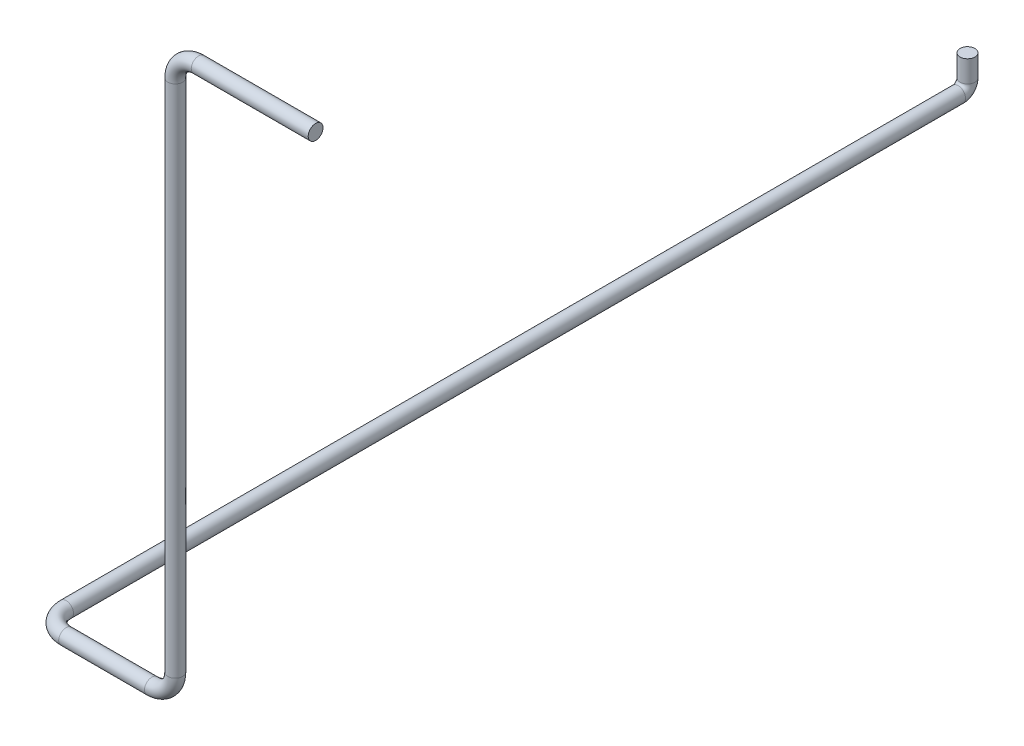
ISO-10303-21;
HEADER;
FILE_DESCRIPTION(('STEP AP214'),'2;1');
FILE_NAME('part.step','',(''),(''),'','','');
FILE_SCHEMA(('AUTOMOTIVE_DESIGN { 1 0 10303 214 1 1 1 1 }'));
ENDSEC;
DATA;
#1=APPLICATION_CONTEXT('core data for automotive mechanical design processes');
#2=APPLICATION_PROTOCOL_DEFINITION('international standard','automotive_design',2000,#1);
#3=PRODUCT_CONTEXT('',#1,'mechanical');
#4=PRODUCT('Part','Part','',(#3));
#5=PRODUCT_RELATED_PRODUCT_CATEGORY('part','',(#4));
#6=PRODUCT_DEFINITION_FORMATION('','',#4);
#7=PRODUCT_DEFINITION_CONTEXT('part definition',#1,'design');
#8=PRODUCT_DEFINITION('design','',#6,#7);
#9=PRODUCT_DEFINITION_SHAPE('','',#8);
#10=(LENGTH_UNIT() NAMED_UNIT(*) SI_UNIT(.MILLI.,.METRE.));
#11=(NAMED_UNIT(*) PLANE_ANGLE_UNIT() SI_UNIT($,.RADIAN.));
#12=(NAMED_UNIT(*) SI_UNIT($,.STERADIAN.) SOLID_ANGLE_UNIT());
#13=UNCERTAINTY_MEASURE_WITH_UNIT(LENGTH_MEASURE(1.E-05),#10,'distance_accuracy_value','');
#14=(GEOMETRIC_REPRESENTATION_CONTEXT(3) GLOBAL_UNCERTAINTY_ASSIGNED_CONTEXT((#13)) GLOBAL_UNIT_ASSIGNED_CONTEXT((#10,
#11,#12)) REPRESENTATION_CONTEXT('',''));
#15=CARTESIAN_POINT('',(0.,0.,0.));
#16=DIRECTION('',(0.,0.,1.));
#17=DIRECTION('',(1.,0.,0.));
#18=AXIS2_PLACEMENT_3D('',#15,#16,#17);
#19=CARTESIAN_POINT('',(0.,-10.,0.));
#20=DIRECTION('',(0.,1.,0.));
#21=DIRECTION('',(0.,0.,1.));
#22=AXIS2_PLACEMENT_3D('',#19,#20,#21);
#23=CYLINDRICAL_SURFACE('',#22,9.525);
#24=CARTESIAN_POINT('',(0.,0.,0.));
#25=DIRECTION('',(0.,1.,0.));
#26=DIRECTION('',(0.,0.,1.));
#27=AXIS2_PLACEMENT_3D('',#24,#25,#26);
#28=CIRCLE('',#27,9.525);
#29=CARTESIAN_POINT('',(0.,0.,9.525));
#30=VERTEX_POINT('',#29);
#31=EDGE_CURVE('E11',#30,#30,#28,.T.);
#32=ORIENTED_EDGE('',*,*,#31,.F.);
#33=EDGE_LOOP('',(#32));
#34=FACE_BOUND('',#33,.T.);
#35=CARTESIAN_POINT('',(0.,-28.,0.));
#36=DIRECTION('',(0.,-1.,0.));
#37=DIRECTION('',(0.,0.,-1.));
#38=AXIS2_PLACEMENT_3D('',#35,#36,#37);
#39=CIRCLE('',#38,9.525);
#40=CARTESIAN_POINT('',(0.,-28.,-9.525));
#41=VERTEX_POINT('',#40);
#42=EDGE_CURVE('E68',#41,#41,#39,.T.);
#43=ORIENTED_EDGE('',*,*,#42,.F.);
#44=EDGE_LOOP('',(#43));
#45=FACE_BOUND('',#44,.T.);
#46=ADVANCED_FACE('F34',(#34,#45),#23,.T.);
#47=CARTESIAN_POINT('',(0.,0.,0.));
#48=DIRECTION('',(0.,1.,0.));
#49=DIRECTION('',(0.,0.,1.));
#50=AXIS2_PLACEMENT_3D('',#47,#48,#49);
#51=PLANE('',#50);
#52=ORIENTED_EDGE('',*,*,#31,.T.);
#53=EDGE_LOOP('',(#52));
#54=FACE_BOUND('',#53,.T.);
#55=ADVANCED_FACE('F75',(#54),#51,.T.);
#56=CARTESIAN_POINT('',(350.,680.,1186.));
#57=DIRECTION('',(1.,0.,0.));
#58=DIRECTION('',(0.,-1.,0.));
#59=AXIS2_PLACEMENT_3D('',#56,#57,#58);
#60=PLANE('',#59);
#61=CARTESIAN_POINT('',(350.,680.,1186.));
#62=DIRECTION('',(1.,0.,0.));
#63=DIRECTION('',(0.,-1.,0.));
#64=AXIS2_PLACEMENT_3D('',#61,#62,#63);
#65=CIRCLE('',#64,9.525);
#66=CARTESIAN_POINT('',(350.,670.475,1186.));
#67=VERTEX_POINT('',#66);
#68=EDGE_CURVE('E40',#67,#67,#65,.T.);
#69=ORIENTED_EDGE('',*,*,#68,.T.);
#70=EDGE_LOOP('',(#69));
#71=FACE_BOUND('',#70,.T.);
#72=ADVANCED_FACE('F44',(#71),#60,.T.);
#73=CARTESIAN_POINT('',(0.,-28.,12.));
#74=DIRECTION('',(-1.,0.,0.));
#75=DIRECTION('',(0.,0.,1.));
#76=AXIS2_PLACEMENT_3D('',#73,#74,#75);
#77=TOROIDAL_SURFACE('',#76,12.,9.525);
#78=CARTESIAN_POINT('',(0.,-40.,12.));
#79=DIRECTION('',(0.,0.,1.));
#80=DIRECTION('',(0.,-1.,0.));
#81=AXIS2_PLACEMENT_3D('',#78,#79,#80);
#82=CIRCLE('',#81,9.525);
#83=CARTESIAN_POINT('',(0.,-49.525,12.));
#84=VERTEX_POINT('',#83);
#85=EDGE_CURVE('E65',#84,#84,#82,.T.);
#86=CARTESIAN_POINT('',(0.,-28.,12.));
#87=DIRECTION('',(-1.,0.,0.));
#88=DIRECTION('',(0.,0.,1.));
#89=AXIS2_PLACEMENT_3D('',#86,#87,#88);
#90=CIRCLE('',#89,21.525);
#91=EDGE_CURVE('',#41,#84,#90,.T.);
#92=ORIENTED_EDGE('',*,*,#42,.T.);
#93=ORIENTED_EDGE('',*,*,#85,.F.);
#94=ORIENTED_EDGE('',*,*,#91,.T.);
#95=ORIENTED_EDGE('',*,*,#91,.F.);
#96=EDGE_LOOP('',(#92,#94,#93,#95));
#97=FACE_BOUND('',#96,.T.);
#98=ADVANCED_FACE('F72',(#97),#77,.T.);
#99=CARTESIAN_POINT('',(0.,-40.,12.));
#100=DIRECTION('',(0.,0.,1.));
#101=DIRECTION('',(1.,0.,0.));
#102=AXIS2_PLACEMENT_3D('',#99,#100,#101);
#103=CYLINDRICAL_SURFACE('',#102,9.525);
#104=CARTESIAN_POINT('',(0.,-40.,1156.));
#105=DIRECTION('',(0.,0.,1.));
#106=DIRECTION('',(0.,-1.,0.));
#107=AXIS2_PLACEMENT_3D('',#104,#105,#106);
#108=CIRCLE('',#107,9.525);
#109=CARTESIAN_POINT('',(-9.52500000000002,-40.,1156.));
#110=VERTEX_POINT('',#109);
#111=EDGE_CURVE('E62',#110,#110,#108,.T.);
#112=ORIENTED_EDGE('',*,*,#111,.F.);
#113=EDGE_LOOP('',(#112));
#114=FACE_BOUND('',#113,.T.);
#115=ORIENTED_EDGE('',*,*,#85,.T.);
#116=EDGE_LOOP('',(#115));
#117=FACE_BOUND('',#116,.T.);
#118=ADVANCED_FACE('F112',(#114,#117),#103,.T.);
#119=CARTESIAN_POINT('',(30.,-40.,1156.));
#120=DIRECTION('',(0.,1.,0.));
#121=DIRECTION('',(0.,0.,1.));
#122=AXIS2_PLACEMENT_3D('',#119,#120,#121);
#123=TOROIDAL_SURFACE('',#122,30.,9.525);
#124=CARTESIAN_POINT('',(30.,-40.,1186.));
#125=DIRECTION('',(1.,0.,0.));
#126=DIRECTION('',(0.,-1.,0.));
#127=AXIS2_PLACEMENT_3D('',#124,#125,#126);
#128=CIRCLE('',#127,9.525);
#129=CARTESIAN_POINT('',(30.,-40.,1195.525));
#130=VERTEX_POINT('',#129);
#131=EDGE_CURVE('E59',#130,#130,#128,.T.);
#132=CARTESIAN_POINT('',(30.,-40.,1156.));
#133=DIRECTION('',(0.,1.,0.));
#134=DIRECTION('',(0.,0.,1.));
#135=AXIS2_PLACEMENT_3D('',#132,#133,#134);
#136=CIRCLE('',#135,39.525);
#137=EDGE_CURVE('',#110,#130,#136,.T.);
#138=ORIENTED_EDGE('',*,*,#111,.T.);
#139=ORIENTED_EDGE('',*,*,#131,.F.);
#140=ORIENTED_EDGE('',*,*,#137,.T.);
#141=ORIENTED_EDGE('',*,*,#137,.F.);
#142=EDGE_LOOP('',(#138,#140,#139,#141));
#143=FACE_BOUND('',#142,.T.);
#144=ADVANCED_FACE('F108',(#143),#123,.T.);
#145=CARTESIAN_POINT('',(30.,-40.,1186.));
#146=DIRECTION('',(1.,0.,0.));
#147=DIRECTION('',(0.,0.,-1.));
#148=AXIS2_PLACEMENT_3D('',#145,#146,#147);
#149=CYLINDRICAL_SURFACE('',#148,9.525);
#150=CARTESIAN_POINT('',(140.,-40.,1186.));
#151=DIRECTION('',(1.,0.,0.));
#152=DIRECTION('',(0.,-1.,0.));
#153=AXIS2_PLACEMENT_3D('',#150,#151,#152);
#154=CIRCLE('',#153,9.525);
#155=CARTESIAN_POINT('',(140.,-49.525,1186.));
#156=VERTEX_POINT('',#155);
#157=EDGE_CURVE('E56',#156,#156,#154,.T.);
#158=ORIENTED_EDGE('',*,*,#157,.F.);
#159=EDGE_LOOP('',(#158));
#160=FACE_BOUND('',#159,.T.);
#161=ORIENTED_EDGE('',*,*,#131,.T.);
#162=EDGE_LOOP('',(#161));
#163=FACE_BOUND('',#162,.T.);
#164=ADVANCED_FACE('F104',(#160,#163),#149,.T.);
#165=CARTESIAN_POINT('',(140.,-10.,1186.));
#166=DIRECTION('',(0.,0.,1.));
#167=DIRECTION('',(1.,0.,0.));
#168=AXIS2_PLACEMENT_3D('',#165,#166,#167);
#169=TOROIDAL_SURFACE('',#168,30.,9.525);
#170=CARTESIAN_POINT('',(170.,-10.,1186.));
#171=DIRECTION('',(0.,1.,0.));
#172=DIRECTION('',(1.,0.,0.));
#173=AXIS2_PLACEMENT_3D('',#170,#171,#172);
#174=CIRCLE('',#173,9.525);
#175=CARTESIAN_POINT('',(179.525,-10.,1186.));
#176=VERTEX_POINT('',#175);
#177=EDGE_CURVE('E53',#176,#176,#174,.T.);
#178=CARTESIAN_POINT('',(140.,-10.,1186.));
#179=DIRECTION('',(0.,0.,1.));
#180=DIRECTION('',(1.,0.,0.));
#181=AXIS2_PLACEMENT_3D('',#178,#179,#180);
#182=CIRCLE('',#181,39.525);
#183=EDGE_CURVE('',#156,#176,#182,.T.);
#184=ORIENTED_EDGE('',*,*,#157,.T.);
#185=ORIENTED_EDGE('',*,*,#177,.F.);
#186=ORIENTED_EDGE('',*,*,#183,.T.);
#187=ORIENTED_EDGE('',*,*,#183,.F.);
#188=EDGE_LOOP('',(#184,#186,#185,#187));
#189=FACE_BOUND('',#188,.T.);
#190=ADVANCED_FACE('F100',(#189),#169,.T.);
#191=CARTESIAN_POINT('',(170.,-10.,1186.));
#192=DIRECTION('',(0.,1.,0.));
#193=DIRECTION('',(0.,0.,1.));
#194=AXIS2_PLACEMENT_3D('',#191,#192,#193);
#195=CYLINDRICAL_SURFACE('',#194,9.525);
#196=CARTESIAN_POINT('',(170.,650.,1186.));
#197=DIRECTION('',(0.,1.,0.));
#198=DIRECTION('',(1.,0.,0.));
#199=AXIS2_PLACEMENT_3D('',#196,#197,#198);
#200=CIRCLE('',#199,9.525);
#201=CARTESIAN_POINT('',(160.475,650.,1186.));
#202=VERTEX_POINT('',#201);
#203=EDGE_CURVE('E48',#202,#202,#200,.T.);
#204=ORIENTED_EDGE('',*,*,#203,.F.);
#205=EDGE_LOOP('',(#204));
#206=FACE_BOUND('',#205,.T.);
#207=ORIENTED_EDGE('',*,*,#177,.T.);
#208=EDGE_LOOP('',(#207));
#209=FACE_BOUND('',#208,.T.);
#210=ADVANCED_FACE('F93',(#206,#209),#195,.T.);
#211=CARTESIAN_POINT('',(200.,650.,1186.));
#212=DIRECTION('',(0.,0.,-1.));
#213=DIRECTION('',(-1.,0.,0.));
#214=AXIS2_PLACEMENT_3D('',#211,#212,#213);
#215=TOROIDAL_SURFACE('',#214,30.,9.525);
#216=CARTESIAN_POINT('',(200.,680.,1186.));
#217=DIRECTION('',(1.,0.,0.));
#218=DIRECTION('',(0.,-1.,0.));
#219=AXIS2_PLACEMENT_3D('',#216,#217,#218);
#220=CIRCLE('',#219,9.525);
#221=CARTESIAN_POINT('',(200.,689.525,1186.));
#222=VERTEX_POINT('',#221);
#223=EDGE_CURVE('E46',#222,#222,#220,.T.);
#224=CARTESIAN_POINT('',(200.,650.,1186.));
#225=DIRECTION('',(0.,0.,-1.));
#226=DIRECTION('',(-1.,0.,0.));
#227=AXIS2_PLACEMENT_3D('',#224,#225,#226);
#228=CIRCLE('',#227,39.525);
#229=EDGE_CURVE('',#202,#222,#228,.T.);
#230=ORIENTED_EDGE('',*,*,#203,.T.);
#231=ORIENTED_EDGE('',*,*,#223,.F.);
#232=ORIENTED_EDGE('',*,*,#229,.T.);
#233=ORIENTED_EDGE('',*,*,#229,.F.);
#234=EDGE_LOOP('',(#230,#232,#231,#233));
#235=FACE_BOUND('',#234,.T.);
#236=ADVANCED_FACE('F88',(#235),#215,.T.);
#237=CARTESIAN_POINT('',(200.,680.,1186.));
#238=DIRECTION('',(1.,0.,0.));
#239=DIRECTION('',(0.,0.,-1.));
#240=AXIS2_PLACEMENT_3D('',#237,#238,#239);
#241=CYLINDRICAL_SURFACE('',#240,9.525);
#242=ORIENTED_EDGE('',*,*,#68,.F.);
#243=EDGE_LOOP('',(#242));
#244=FACE_BOUND('',#243,.T.);
#245=ORIENTED_EDGE('',*,*,#223,.T.);
#246=EDGE_LOOP('',(#245));
#247=FACE_BOUND('',#246,.T.);
#248=ADVANCED_FACE('F81',(#244,#247),#241,.T.);
#249=CLOSED_SHELL('',(#46,#55,#72,#98,#118,#144,#164,#190,#210,#236,#248));
#250=MANIFOLD_SOLID_BREP('B2',#249);
#251=ADVANCED_BREP_SHAPE_REPRESENTATION('',(#18,#250),#14);
#252=SHAPE_DEFINITION_REPRESENTATION(#9,#251);
ENDSEC;
END-ISO-10303-21;
